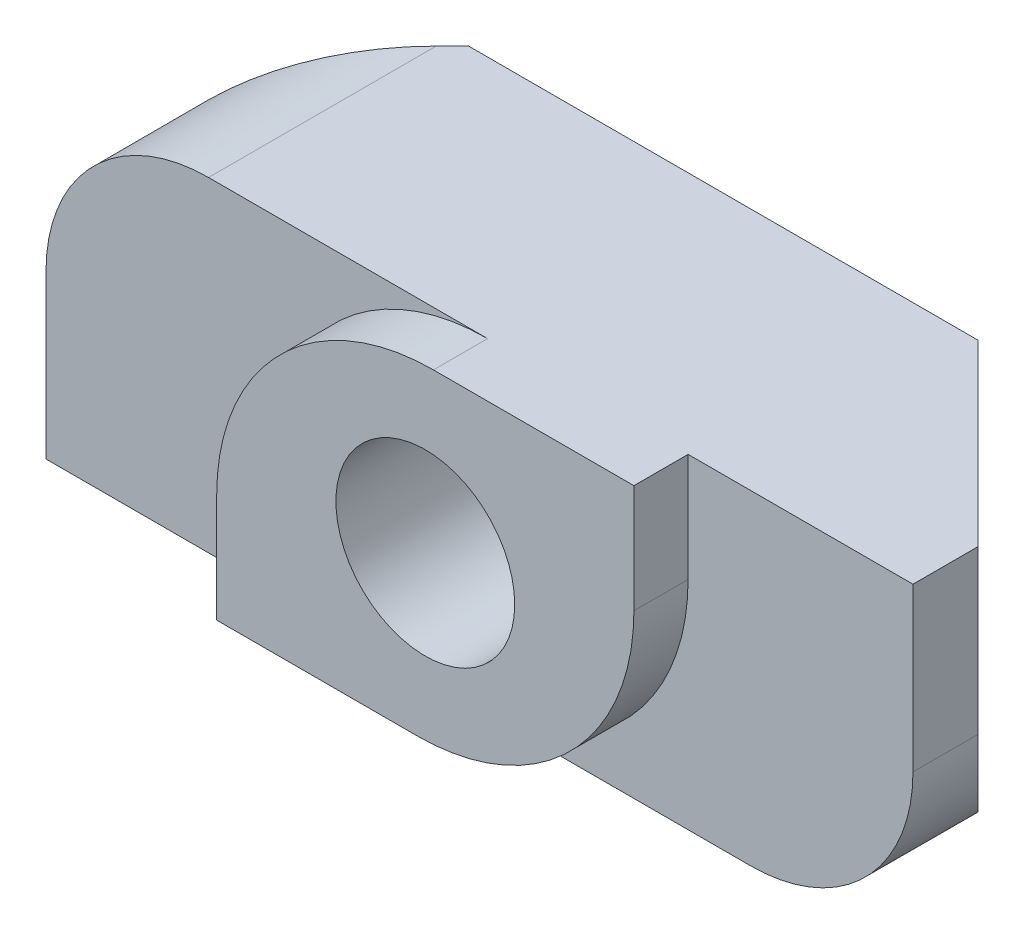
ISO-10303-21;
HEADER;
FILE_DESCRIPTION(('STEP AP214'),'2;1');
FILE_NAME('part.step','',(''),(''),'','','');
FILE_SCHEMA(('AUTOMOTIVE_DESIGN { 1 0 10303 214 1 1 1 1 }'));
ENDSEC;
DATA;
#1=APPLICATION_CONTEXT('core data for automotive mechanical design processes');
#2=APPLICATION_PROTOCOL_DEFINITION('international standard','automotive_design',2000,#1);
#3=PRODUCT_CONTEXT('',#1,'mechanical');
#4=PRODUCT('Part','Part','',(#3));
#5=PRODUCT_RELATED_PRODUCT_CATEGORY('part','',(#4));
#6=PRODUCT_DEFINITION_FORMATION('','',#4);
#7=PRODUCT_DEFINITION_CONTEXT('part definition',#1,'design');
#8=PRODUCT_DEFINITION('design','',#6,#7);
#9=PRODUCT_DEFINITION_SHAPE('','',#8);
#10=(LENGTH_UNIT() NAMED_UNIT(*) SI_UNIT(.MILLI.,.METRE.));
#11=(NAMED_UNIT(*) PLANE_ANGLE_UNIT() SI_UNIT($,.RADIAN.));
#12=(NAMED_UNIT(*) SI_UNIT($,.STERADIAN.) SOLID_ANGLE_UNIT());
#13=UNCERTAINTY_MEASURE_WITH_UNIT(LENGTH_MEASURE(1.E-05),#10,'distance_accuracy_value','');
#14=(GEOMETRIC_REPRESENTATION_CONTEXT(3) GLOBAL_UNCERTAINTY_ASSIGNED_CONTEXT((#13)) GLOBAL_UNIT_ASSIGNED_CONTEXT((#10,
#11,#12)) REPRESENTATION_CONTEXT('',''));
#15=CARTESIAN_POINT('',(0.,0.,0.));
#16=DIRECTION('',(0.,0.,1.));
#17=DIRECTION('',(1.,0.,0.));
#18=AXIS2_PLACEMENT_3D('',#15,#16,#17);
#19=CARTESIAN_POINT('',(-4.70000000000001,6.,0.));
#20=DIRECTION('',(0.707106781186549,0.,0.707106781186546));
#21=DIRECTION('',(0.707106781186546,0.,-0.707106781186549));
#22=AXIS2_PLACEMENT_3D('',#19,#20,#21);
#23=PLANE('',#22);
#24=DIRECTION('',(0.,-1.,0.));
#25=VECTOR('',#24,1.);
#26=CARTESIAN_POINT('',(-8.,6.,3.3));
#27=LINE('',#26,#25);
#28=CARTESIAN_POINT('',(-8.,3.,3.3));
#29=VERTEX_POINT('',#28);
#30=CARTESIAN_POINT('',(-8.,0.,3.3));
#31=VERTEX_POINT('',#30);
#32=EDGE_CURVE('E210',#29,#31,#27,.T.);
#33=ORIENTED_EDGE('',*,*,#32,.F.);
#34=CARTESIAN_POINT('',(-4.99999999999999,3.,0.299999999999985));
#35=DIRECTION('',(0.707106781186549,0.,0.707106781186546));
#36=DIRECTION('',(0.707106781186546,0.,-0.707106781186549));
#37=AXIS2_PLACEMENT_3D('',#34,#35,#36);
#38=ELLIPSE('',#37,4.2426406871193,3.);
#39=CARTESIAN_POINT('',(-4.99999999999999,6.,0.299999999999985));
#40=VERTEX_POINT('',#39);
#41=EDGE_CURVE('E235',#29,#40,#38,.F.);
#42=ORIENTED_EDGE('',*,*,#41,.T.);
#43=DIRECTION('',(-0.707106781186546,0.,0.707106781186549));
#44=VECTOR('',#43,1.);
#45=CARTESIAN_POINT('',(-4.70000000000001,6.,0.));
#46=LINE('',#45,#44);
#47=CARTESIAN_POINT('',(-4.70000000000001,6.,0.));
#48=VERTEX_POINT('',#47);
#49=EDGE_CURVE('E193',#48,#40,#46,.T.);
#50=ORIENTED_EDGE('',*,*,#49,.F.);
#51=DIRECTION('',(0.,-1.,0.));
#52=VECTOR('',#51,1.);
#53=CARTESIAN_POINT('',(-4.70000000000001,6.,0.));
#54=LINE('',#53,#52);
#55=CARTESIAN_POINT('',(-4.70000000000001,0.,0.));
#56=VERTEX_POINT('',#55);
#57=EDGE_CURVE('E171',#48,#56,#54,.T.);
#58=ORIENTED_EDGE('',*,*,#57,.T.);
#59=DIRECTION('',(-0.707106781186546,0.,0.707106781186549));
#60=VECTOR('',#59,1.);
#61=CARTESIAN_POINT('',(-4.70000000000001,0.,0.));
#62=LINE('',#61,#60);
#63=EDGE_CURVE('E172',#56,#31,#62,.T.);
#64=ORIENTED_EDGE('',*,*,#63,.T.);
#65=EDGE_LOOP('',(#33,#42,#50,#58,#64));
#66=FACE_BOUND('',#65,.T.);
#67=ADVANCED_FACE('F34',(#66),#23,.F.);
#68=CARTESIAN_POINT('',(-8.,6.,3.3));
#69=DIRECTION('',(1.,0.,0.));
#70=DIRECTION('',(0.,0.,-1.));
#71=AXIS2_PLACEMENT_3D('',#68,#69,#70);
#72=PLANE('',#71);
#73=DIRECTION('',(0.,-1.,0.));
#74=VECTOR('',#73,1.);
#75=CARTESIAN_POINT('',(-8.,6.,4.5));
#76=LINE('',#75,#74);
#77=CARTESIAN_POINT('',(-8.,3.,4.5));
#78=VERTEX_POINT('',#77);
#79=CARTESIAN_POINT('',(-8.,0.,4.5));
#80=VERTEX_POINT('',#79);
#81=EDGE_CURVE('E208',#78,#80,#76,.T.);
#82=ORIENTED_EDGE('',*,*,#81,.F.);
#83=DIRECTION('',(0.,0.,1.));
#84=VECTOR('',#83,1.);
#85=CARTESIAN_POINT('',(-8.,3.,3.3));
#86=LINE('',#85,#84);
#87=EDGE_CURVE('E233',#78,#29,#86,.F.);
#88=ORIENTED_EDGE('',*,*,#87,.T.);
#89=ORIENTED_EDGE('',*,*,#32,.T.);
#90=DIRECTION('',(0.,0.,1.));
#91=VECTOR('',#90,1.);
#92=CARTESIAN_POINT('',(-8.,0.,3.3));
#93=LINE('',#92,#91);
#94=EDGE_CURVE('E175',#31,#80,#93,.T.);
#95=ORIENTED_EDGE('',*,*,#94,.T.);
#96=EDGE_LOOP('',(#82,#88,#89,#95));
#97=FACE_BOUND('',#96,.T.);
#98=ADVANCED_FACE('F263',(#97),#72,.F.);
#99=CARTESIAN_POINT('',(-8.,6.,4.5));
#100=DIRECTION('',(0.,0.,-1.));
#101=DIRECTION('',(-1.,0.,0.));
#102=AXIS2_PLACEMENT_3D('',#99,#100,#101);
#103=PLANE('',#102);
#104=DIRECTION('',(1.,0.,0.));
#105=VECTOR('',#104,1.);
#106=CARTESIAN_POINT('',(-8.,6.,4.5));
#107=LINE('',#106,#105);
#108=CARTESIAN_POINT('',(-5.,6.,4.5));
#109=VERTEX_POINT('',#108);
#110=CARTESIAN_POINT('',(0.149999999999997,6.,4.5));
#111=VERTEX_POINT('',#110);
#112=EDGE_CURVE('E143',#109,#111,#107,.T.);
#113=ORIENTED_EDGE('',*,*,#112,.F.);
#114=CARTESIAN_POINT('',(-5.,3.,4.5));
#115=DIRECTION('',(0.,0.,-1.));
#116=DIRECTION('',(-1.,0.,0.));
#117=AXIS2_PLACEMENT_3D('',#114,#115,#116);
#118=CIRCLE('',#117,3.);
#119=EDGE_CURVE('E231',#109,#78,#118,.F.);
#120=ORIENTED_EDGE('',*,*,#119,.T.);
#121=ORIENTED_EDGE('',*,*,#81,.T.);
#122=DIRECTION('',(1.,0.,0.));
#123=VECTOR('',#122,1.);
#124=CARTESIAN_POINT('',(-8.,0.,4.5));
#125=LINE('',#124,#123);
#126=CARTESIAN_POINT('',(-3.85,0.,4.5));
#127=VERTEX_POINT('',#126);
#128=EDGE_CURVE('E179',#80,#127,#125,.T.);
#129=ORIENTED_EDGE('',*,*,#128,.T.);
#130=DIRECTION('',(0.,-1.,0.));
#131=VECTOR('',#130,1.);
#132=CARTESIAN_POINT('',(-3.85,6.,4.5));
#133=LINE('',#132,#131);
#134=CARTESIAN_POINT('',(-3.85,2.,4.5));
#135=VERTEX_POINT('',#134);
#136=EDGE_CURVE('E206',#135,#127,#133,.T.);
#137=ORIENTED_EDGE('',*,*,#136,.F.);
#138=CARTESIAN_POINT('',(0.15,2.,4.5));
#139=DIRECTION('',(0.,0.,-1.));
#140=DIRECTION('',(-1.,0.,0.));
#141=AXIS2_PLACEMENT_3D('',#138,#139,#140);
#142=CIRCLE('',#141,4.);
#143=EDGE_CURVE('E222',#135,#111,#142,.T.);
#144=ORIENTED_EDGE('',*,*,#143,.T.);
#145=EDGE_LOOP('',(#113,#120,#121,#129,#137,#144));
#146=FACE_BOUND('',#145,.T.);
#147=ADVANCED_FACE('F269',(#146),#103,.F.);
#148=CARTESIAN_POINT('',(-3.85,6.,4.5));
#149=DIRECTION('',(1.,0.,0.));
#150=DIRECTION('',(0.,0.,-1.));
#151=AXIS2_PLACEMENT_3D('',#148,#149,#150);
#152=PLANE('',#151);
#153=DIRECTION('',(0.,-1.,0.));
#154=VECTOR('',#153,1.);
#155=CARTESIAN_POINT('',(-3.85,6.,5.5));
#156=LINE('',#155,#154);
#157=CARTESIAN_POINT('',(-3.85,2.,5.5));
#158=VERTEX_POINT('',#157);
#159=CARTESIAN_POINT('',(-3.85,0.,5.5));
#160=VERTEX_POINT('',#159);
#161=EDGE_CURVE('E154',#158,#160,#156,.T.);
#162=ORIENTED_EDGE('',*,*,#161,.F.);
#163=DIRECTION('',(0.,0.,1.));
#164=VECTOR('',#163,1.);
#165=CARTESIAN_POINT('',(-3.85,2.,4.5));
#166=LINE('',#165,#164);
#167=EDGE_CURVE('E216',#158,#135,#166,.F.);
#168=ORIENTED_EDGE('',*,*,#167,.T.);
#169=ORIENTED_EDGE('',*,*,#136,.T.);
#170=DIRECTION('',(0.,0.,1.));
#171=VECTOR('',#170,1.);
#172=CARTESIAN_POINT('',(-3.85,0.,4.5));
#173=LINE('',#172,#171);
#174=EDGE_CURVE('E182',#127,#160,#173,.T.);
#175=ORIENTED_EDGE('',*,*,#174,.T.);
#176=EDGE_LOOP('',(#162,#168,#169,#175));
#177=FACE_BOUND('',#176,.T.);
#178=ADVANCED_FACE('F291',(#177),#152,.F.);
#179=CARTESIAN_POINT('',(-3.85,6.,5.5));
#180=DIRECTION('',(0.,0.,-1.));
#181=DIRECTION('',(-1.,0.,0.));
#182=AXIS2_PLACEMENT_3D('',#179,#180,#181);
#183=PLANE('',#182);
#184=CARTESIAN_POINT('',(0.,3.,5.5));
#185=DIRECTION('',(0.,0.,1.));
#186=DIRECTION('',(1.,0.,0.));
#187=AXIS2_PLACEMENT_3D('',#184,#185,#186);
#188=CIRCLE('',#187,1.65);
#189=CARTESIAN_POINT('',(1.65,3.,5.5));
#190=VERTEX_POINT('',#189);
#191=EDGE_CURVE('E306',#190,#190,#188,.T.);
#192=ORIENTED_EDGE('',*,*,#191,.F.);
#193=EDGE_LOOP('',(#192));
#194=FACE_BOUND('',#193,.T.);
#195=DIRECTION('',(1.,0.,0.));
#196=VECTOR('',#195,1.);
#197=CARTESIAN_POINT('',(-3.85,6.,5.5));
#198=LINE('',#197,#196);
#199=CARTESIAN_POINT('',(0.149999999999998,6.,5.5));
#200=VERTEX_POINT('',#199);
#201=CARTESIAN_POINT('',(3.85,6.,5.5));
#202=VERTEX_POINT('',#201);
#203=EDGE_CURVE('E133',#200,#202,#198,.T.);
#204=ORIENTED_EDGE('',*,*,#203,.F.);
#205=CARTESIAN_POINT('',(0.15,2.,5.5));
#206=DIRECTION('',(0.,0.,-1.));
#207=DIRECTION('',(-1.,0.,0.));
#208=AXIS2_PLACEMENT_3D('',#205,#206,#207);
#209=CIRCLE('',#208,4.);
#210=EDGE_CURVE('E214',#200,#158,#209,.F.);
#211=ORIENTED_EDGE('',*,*,#210,.T.);
#212=ORIENTED_EDGE('',*,*,#161,.T.);
#213=DIRECTION('',(1.,0.,0.));
#214=VECTOR('',#213,1.);
#215=CARTESIAN_POINT('',(-3.85,0.,5.5));
#216=LINE('',#215,#214);
#217=CARTESIAN_POINT('',(-0.150000000000001,0.,5.5));
#218=VERTEX_POINT('',#217);
#219=EDGE_CURVE('E185',#160,#218,#216,.T.);
#220=ORIENTED_EDGE('',*,*,#219,.T.);
#221=CARTESIAN_POINT('',(-0.15,4.,5.5));
#222=DIRECTION('',(0.,0.,-1.));
#223=DIRECTION('',(-1.,0.,0.));
#224=AXIS2_PLACEMENT_3D('',#221,#222,#223);
#225=CIRCLE('',#224,4.);
#226=CARTESIAN_POINT('',(3.85,4.,5.5));
#227=VERTEX_POINT('',#226);
#228=EDGE_CURVE('E150',#218,#227,#225,.F.);
#229=ORIENTED_EDGE('',*,*,#228,.T.);
#230=DIRECTION('',(0.,-1.,0.));
#231=VECTOR('',#230,1.);
#232=CARTESIAN_POINT('',(3.85,6.,5.5));
#233=LINE('',#232,#231);
#234=EDGE_CURVE('E146',#202,#227,#233,.T.);
#235=ORIENTED_EDGE('',*,*,#234,.F.);
#236=EDGE_LOOP('',(#204,#211,#212,#220,#229,#235));
#237=FACE_BOUND('',#236,.T.);
#238=ADVANCED_FACE('F147',(#194,#237),#183,.F.);
#239=CARTESIAN_POINT('',(3.85,6.,4.5));
#240=DIRECTION('',(-1.,0.,0.));
#241=DIRECTION('',(0.,0.,1.));
#242=AXIS2_PLACEMENT_3D('',#239,#240,#241);
#243=PLANE('',#242);
#244=ORIENTED_EDGE('',*,*,#234,.T.);
#245=DIRECTION('',(0.,0.,-1.));
#246=VECTOR('',#245,1.);
#247=CARTESIAN_POINT('',(3.85,4.,4.5));
#248=LINE('',#247,#246);
#249=CARTESIAN_POINT('',(3.85,4.,4.5));
#250=VERTEX_POINT('',#249);
#251=EDGE_CURVE('E218',#227,#250,#248,.T.);
#252=ORIENTED_EDGE('',*,*,#251,.T.);
#253=DIRECTION('',(0.,-1.,0.));
#254=VECTOR('',#253,1.);
#255=CARTESIAN_POINT('',(3.85,6.,4.5));
#256=LINE('',#255,#254);
#257=CARTESIAN_POINT('',(3.85,6.,4.5));
#258=VERTEX_POINT('',#257);
#259=EDGE_CURVE('E155',#258,#250,#256,.T.);
#260=ORIENTED_EDGE('',*,*,#259,.F.);
#261=DIRECTION('',(0.,0.,-1.));
#262=VECTOR('',#261,1.);
#263=CARTESIAN_POINT('',(3.85,6.,4.5));
#264=LINE('',#263,#262);
#265=EDGE_CURVE('E138',#202,#258,#264,.T.);
#266=ORIENTED_EDGE('',*,*,#265,.F.);
#267=EDGE_LOOP('',(#244,#252,#260,#266));
#268=FACE_BOUND('',#267,.T.);
#269=ADVANCED_FACE('F157',(#268),#243,.F.);
#270=CARTESIAN_POINT('',(8.,6.,4.5));
#271=DIRECTION('',(0.,0.,-1.));
#272=DIRECTION('',(-1.,0.,0.));
#273=AXIS2_PLACEMENT_3D('',#270,#271,#272);
#274=PLANE('',#273);
#275=DIRECTION('',(1.,0.,0.));
#276=VECTOR('',#275,1.);
#277=CARTESIAN_POINT('',(8.,0.,4.5));
#278=LINE('',#277,#276);
#279=CARTESIAN_POINT('',(-0.15,0.,4.5));
#280=VERTEX_POINT('',#279);
#281=CARTESIAN_POINT('',(5.,0.,4.5));
#282=VERTEX_POINT('',#281);
#283=EDGE_CURVE('E187',#280,#282,#278,.T.);
#284=ORIENTED_EDGE('',*,*,#283,.T.);
#285=CARTESIAN_POINT('',(5.,3.,4.5));
#286=DIRECTION('',(0.,0.,-1.));
#287=DIRECTION('',(-1.,0.,0.));
#288=AXIS2_PLACEMENT_3D('',#285,#286,#287);
#289=CIRCLE('',#288,3.);
#290=CARTESIAN_POINT('',(8.,3.,4.5));
#291=VERTEX_POINT('',#290);
#292=EDGE_CURVE('E11',#282,#291,#289,.F.);
#293=ORIENTED_EDGE('',*,*,#292,.T.);
#294=DIRECTION('',(0.,-1.,0.));
#295=VECTOR('',#294,1.);
#296=CARTESIAN_POINT('',(8.,6.,4.5));
#297=LINE('',#296,#295);
#298=CARTESIAN_POINT('',(8.,6.,4.5));
#299=VERTEX_POINT('',#298);
#300=EDGE_CURVE('E201',#299,#291,#297,.T.);
#301=ORIENTED_EDGE('',*,*,#300,.F.);
#302=DIRECTION('',(1.,0.,0.));
#303=VECTOR('',#302,1.);
#304=CARTESIAN_POINT('',(8.,6.,4.5));
#305=LINE('',#304,#303);
#306=EDGE_CURVE('E160',#258,#299,#305,.T.);
#307=ORIENTED_EDGE('',*,*,#306,.F.);
#308=ORIENTED_EDGE('',*,*,#259,.T.);
#309=CARTESIAN_POINT('',(-0.15,4.,4.5));
#310=DIRECTION('',(0.,0.,-1.));
#311=DIRECTION('',(-1.,0.,0.));
#312=AXIS2_PLACEMENT_3D('',#309,#310,#311);
#313=CIRCLE('',#312,4.);
#314=EDGE_CURVE('E225',#250,#280,#313,.T.);
#315=ORIENTED_EDGE('',*,*,#314,.T.);
#316=EDGE_LOOP('',(#284,#293,#301,#307,#308,#315));
#317=FACE_BOUND('',#316,.T.);
#318=ADVANCED_FACE('F254',(#317),#274,.F.);
#319=CARTESIAN_POINT('',(8.,6.,3.3));
#320=DIRECTION('',(-1.,0.,0.));
#321=DIRECTION('',(0.,0.,1.));
#322=AXIS2_PLACEMENT_3D('',#319,#320,#321);
#323=PLANE('',#322);
#324=ORIENTED_EDGE('',*,*,#300,.T.);
#325=DIRECTION('',(0.,0.,-1.));
#326=VECTOR('',#325,1.);
#327=CARTESIAN_POINT('',(8.,3.,3.3));
#328=LINE('',#327,#326);
#329=CARTESIAN_POINT('',(8.,3.,3.3));
#330=VERTEX_POINT('',#329);
#331=EDGE_CURVE('E237',#291,#330,#328,.T.);
#332=ORIENTED_EDGE('',*,*,#331,.T.);
#333=DIRECTION('',(0.,-1.,0.));
#334=VECTOR('',#333,1.);
#335=CARTESIAN_POINT('',(8.,6.,3.3));
#336=LINE('',#335,#334);
#337=CARTESIAN_POINT('',(8.,6.,3.3));
#338=VERTEX_POINT('',#337);
#339=EDGE_CURVE('E199',#338,#330,#336,.T.);
#340=ORIENTED_EDGE('',*,*,#339,.F.);
#341=DIRECTION('',(0.,0.,-1.));
#342=VECTOR('',#341,1.);
#343=CARTESIAN_POINT('',(8.,6.,3.3));
#344=LINE('',#343,#342);
#345=EDGE_CURVE('E162',#299,#338,#344,.T.);
#346=ORIENTED_EDGE('',*,*,#345,.F.);
#347=EDGE_LOOP('',(#324,#332,#340,#346));
#348=FACE_BOUND('',#347,.T.);
#349=ADVANCED_FACE('F243',(#348),#323,.F.);
#350=CARTESIAN_POINT('',(4.70000000000001,6.,0.));
#351=DIRECTION('',(-0.707106781186549,0.,0.707106781186546));
#352=DIRECTION('',(0.707106781186546,0.,0.707106781186549));
#353=AXIS2_PLACEMENT_3D('',#350,#351,#352);
#354=PLANE('',#353);
#355=ORIENTED_EDGE('',*,*,#339,.T.);
#356=CARTESIAN_POINT('',(4.99999999999999,3.,0.299999999999984));
#357=DIRECTION('',(-0.707106781186549,0.,0.707106781186546));
#358=DIRECTION('',(-0.707106781186546,0.,-0.707106781186549));
#359=AXIS2_PLACEMENT_3D('',#356,#357,#358);
#360=ELLIPSE('',#359,4.2426406871193,3.);
#361=CARTESIAN_POINT('',(4.99999999999999,0.,0.299999999999985));
#362=VERTEX_POINT('',#361);
#363=EDGE_CURVE('E56',#330,#362,#360,.F.);
#364=ORIENTED_EDGE('',*,*,#363,.T.);
#365=DIRECTION('',(-0.707106781186546,0.,-0.707106781186549));
#366=VECTOR('',#365,1.);
#367=CARTESIAN_POINT('',(4.70000000000001,0.,0.));
#368=LINE('',#367,#366);
#369=CARTESIAN_POINT('',(4.70000000000001,0.,0.));
#370=VERTEX_POINT('',#369);
#371=EDGE_CURVE('E189',#362,#370,#368,.T.);
#372=ORIENTED_EDGE('',*,*,#371,.T.);
#373=DIRECTION('',(0.,-1.,0.));
#374=VECTOR('',#373,1.);
#375=CARTESIAN_POINT('',(4.70000000000001,6.,0.));
#376=LINE('',#375,#374);
#377=CARTESIAN_POINT('',(4.70000000000001,6.,0.));
#378=VERTEX_POINT('',#377);
#379=EDGE_CURVE('E196',#378,#370,#376,.T.);
#380=ORIENTED_EDGE('',*,*,#379,.F.);
#381=DIRECTION('',(-0.707106781186546,0.,-0.707106781186549));
#382=VECTOR('',#381,1.);
#383=CARTESIAN_POINT('',(4.70000000000001,6.,0.));
#384=LINE('',#383,#382);
#385=EDGE_CURVE('E167',#338,#378,#384,.T.);
#386=ORIENTED_EDGE('',*,*,#385,.F.);
#387=EDGE_LOOP('',(#355,#364,#372,#380,#386));
#388=FACE_BOUND('',#387,.T.);
#389=ADVANCED_FACE('F249',(#388),#354,.F.);
#390=CARTESIAN_POINT('',(4.70000000000001,6.,0.));
#391=DIRECTION('',(0.,0.,1.));
#392=DIRECTION('',(1.,0.,0.));
#393=AXIS2_PLACEMENT_3D('',#390,#391,#392);
#394=PLANE('',#393);
#395=CARTESIAN_POINT('',(0.,3.,0.));
#396=DIRECTION('',(0.,0.,1.));
#397=DIRECTION('',(1.,0.,0.));
#398=AXIS2_PLACEMENT_3D('',#395,#396,#397);
#399=CIRCLE('',#398,1.65);
#400=CARTESIAN_POINT('',(1.65,3.,0.));
#401=VERTEX_POINT('',#400);
#402=EDGE_CURVE('E176',#401,#401,#399,.T.);
#403=ORIENTED_EDGE('',*,*,#402,.T.);
#404=EDGE_LOOP('',(#403));
#405=FACE_BOUND('',#404,.T.);
#406=DIRECTION('',(-1.,0.,0.));
#407=VECTOR('',#406,1.);
#408=CARTESIAN_POINT('',(4.70000000000001,0.,0.));
#409=LINE('',#408,#407);
#410=EDGE_CURVE('E191',#370,#56,#409,.T.);
#411=ORIENTED_EDGE('',*,*,#410,.T.);
#412=ORIENTED_EDGE('',*,*,#57,.F.);
#413=DIRECTION('',(-1.,0.,0.));
#414=VECTOR('',#413,1.);
#415=CARTESIAN_POINT('',(4.70000000000001,6.,0.));
#416=LINE('',#415,#414);
#417=EDGE_CURVE('E169',#378,#48,#416,.T.);
#418=ORIENTED_EDGE('',*,*,#417,.F.);
#419=ORIENTED_EDGE('',*,*,#379,.T.);
#420=EDGE_LOOP('',(#411,#412,#418,#419));
#421=FACE_BOUND('',#420,.T.);
#422=ADVANCED_FACE('F312',(#405,#421),#394,.F.);
#423=CARTESIAN_POINT('',(0.,6.,0.));
#424=DIRECTION('',(0.,1.,0.));
#425=DIRECTION('',(0.,0.,1.));
#426=AXIS2_PLACEMENT_3D('',#423,#424,#425);
#427=PLANE('',#426);
#428=ORIENTED_EDGE('',*,*,#49,.T.);
#429=DIRECTION('',(0.,0.,1.));
#430=VECTOR('',#429,1.);
#431=CARTESIAN_POINT('',(-5.,6.,4.50000000000001));
#432=LINE('',#431,#430);
#433=EDGE_CURVE('E228',#40,#109,#432,.T.);
#434=ORIENTED_EDGE('',*,*,#433,.T.);
#435=ORIENTED_EDGE('',*,*,#112,.T.);
#436=DIRECTION('',(0.,0.,1.));
#437=VECTOR('',#436,1.);
#438=CARTESIAN_POINT('',(0.15,6.,5.5));
#439=LINE('',#438,#437);
#440=EDGE_CURVE('E141',#111,#200,#439,.T.);
#441=ORIENTED_EDGE('',*,*,#440,.T.);
#442=ORIENTED_EDGE('',*,*,#203,.T.);
#443=ORIENTED_EDGE('',*,*,#265,.T.);
#444=ORIENTED_EDGE('',*,*,#306,.T.);
#445=ORIENTED_EDGE('',*,*,#345,.T.);
#446=ORIENTED_EDGE('',*,*,#385,.T.);
#447=ORIENTED_EDGE('',*,*,#417,.T.);
#448=EDGE_LOOP('',(#428,#434,#435,#441,#442,#443,#444,#445,#446,#447));
#449=FACE_BOUND('',#448,.T.);
#450=ADVANCED_FACE('F136',(#449),#427,.T.);
#451=CARTESIAN_POINT('',(0.,0.,0.));
#452=DIRECTION('',(0.,1.,0.));
#453=DIRECTION('',(0.,0.,1.));
#454=AXIS2_PLACEMENT_3D('',#451,#452,#453);
#455=PLANE('',#454);
#456=ORIENTED_EDGE('',*,*,#371,.F.);
#457=DIRECTION('',(0.,0.,-1.));
#458=VECTOR('',#457,1.);
#459=CARTESIAN_POINT('',(4.99999999999999,0.,0.));
#460=LINE('',#459,#458);
#461=EDGE_CURVE('E42',#362,#282,#460,.F.);
#462=ORIENTED_EDGE('',*,*,#461,.T.);
#463=ORIENTED_EDGE('',*,*,#283,.F.);
#464=DIRECTION('',(0.,0.,-1.));
#465=VECTOR('',#464,1.);
#466=CARTESIAN_POINT('',(-0.15,0.,0.));
#467=LINE('',#466,#465);
#468=EDGE_CURVE('E220',#280,#218,#467,.F.);
#469=ORIENTED_EDGE('',*,*,#468,.T.);
#470=ORIENTED_EDGE('',*,*,#219,.F.);
#471=ORIENTED_EDGE('',*,*,#174,.F.);
#472=ORIENTED_EDGE('',*,*,#128,.F.);
#473=ORIENTED_EDGE('',*,*,#94,.F.);
#474=ORIENTED_EDGE('',*,*,#63,.F.);
#475=ORIENTED_EDGE('',*,*,#410,.F.);
#476=EDGE_LOOP('',(#456,#462,#463,#469,#470,#471,#472,#473,#474,#475));
#477=FACE_BOUND('',#476,.T.);
#478=ADVANCED_FACE('F286',(#477),#455,.F.);
#479=CARTESIAN_POINT('',(0.,3.,0.));
#480=DIRECTION('',(0.,0.,1.));
#481=DIRECTION('',(1.,0.,0.));
#482=AXIS2_PLACEMENT_3D('',#479,#480,#481);
#483=CYLINDRICAL_SURFACE('',#482,1.65);
#484=ORIENTED_EDGE('',*,*,#402,.F.);
#485=EDGE_LOOP('',(#484));
#486=FACE_BOUND('',#485,.T.);
#487=ORIENTED_EDGE('',*,*,#191,.T.);
#488=EDGE_LOOP('',(#487));
#489=FACE_BOUND('',#488,.T.);
#490=ADVANCED_FACE('F278',(#486,#489),#483,.F.);
#491=CARTESIAN_POINT('',(0.15,2.,0.));
#492=DIRECTION('',(0.,0.,-1.));
#493=DIRECTION('',(-1.,0.,0.));
#494=AXIS2_PLACEMENT_3D('',#491,#492,#493);
#495=CYLINDRICAL_SURFACE('',#494,4.);
#496=ORIENTED_EDGE('',*,*,#143,.F.);
#497=ORIENTED_EDGE('',*,*,#167,.F.);
#498=ORIENTED_EDGE('',*,*,#210,.F.);
#499=ORIENTED_EDGE('',*,*,#440,.F.);
#500=EDGE_LOOP('',(#496,#497,#498,#499));
#501=FACE_BOUND('',#500,.T.);
#502=ADVANCED_FACE('F275',(#501),#495,.T.);
#503=CARTESIAN_POINT('',(-0.15,4.,4.5));
#504=DIRECTION('',(0.,0.,-1.));
#505=DIRECTION('',(-1.,0.,0.));
#506=AXIS2_PLACEMENT_3D('',#503,#504,#505);
#507=CYLINDRICAL_SURFACE('',#506,4.);
#508=ORIENTED_EDGE('',*,*,#228,.F.);
#509=ORIENTED_EDGE('',*,*,#468,.F.);
#510=ORIENTED_EDGE('',*,*,#314,.F.);
#511=ORIENTED_EDGE('',*,*,#251,.F.);
#512=EDGE_LOOP('',(#508,#509,#510,#511));
#513=FACE_BOUND('',#512,.T.);
#514=ADVANCED_FACE('F260',(#513),#507,.T.);
#515=CARTESIAN_POINT('',(-4.99999999999999,3.,0.));
#516=DIRECTION('',(0.,0.,-1.));
#517=DIRECTION('',(-1.,0.,0.));
#518=AXIS2_PLACEMENT_3D('',#515,#516,#517);
#519=CYLINDRICAL_SURFACE('',#518,3.);
#520=ORIENTED_EDGE('',*,*,#41,.F.);
#521=ORIENTED_EDGE('',*,*,#87,.F.);
#522=ORIENTED_EDGE('',*,*,#119,.F.);
#523=ORIENTED_EDGE('',*,*,#433,.F.);
#524=EDGE_LOOP('',(#520,#521,#522,#523));
#525=FACE_BOUND('',#524,.T.);
#526=ADVANCED_FACE('F256',(#525),#519,.T.);
#527=CARTESIAN_POINT('',(5.,3.,3.30000000000001));
#528=DIRECTION('',(0.,0.,-1.));
#529=DIRECTION('',(-1.,0.,0.));
#530=AXIS2_PLACEMENT_3D('',#527,#528,#529);
#531=CYLINDRICAL_SURFACE('',#530,3.);
#532=ORIENTED_EDGE('',*,*,#292,.F.);
#533=ORIENTED_EDGE('',*,*,#461,.F.);
#534=ORIENTED_EDGE('',*,*,#363,.F.);
#535=ORIENTED_EDGE('',*,*,#331,.F.);
#536=EDGE_LOOP('',(#532,#533,#534,#535));
#537=FACE_BOUND('',#536,.T.);
#538=ADVANCED_FACE('F36',(#537),#531,.T.);
#539=CLOSED_SHELL('',(#67,#98,#147,#178,#238,#269,#318,#349,#389,#422,#450,#478,#490,#502,#514,
#526,#538));
#540=MANIFOLD_SOLID_BREP('B2',#539);
#541=ADVANCED_BREP_SHAPE_REPRESENTATION('',(#18,#540),#14);
#542=SHAPE_DEFINITION_REPRESENTATION(#9,#541);
ENDSEC;
END-ISO-10303-21;
